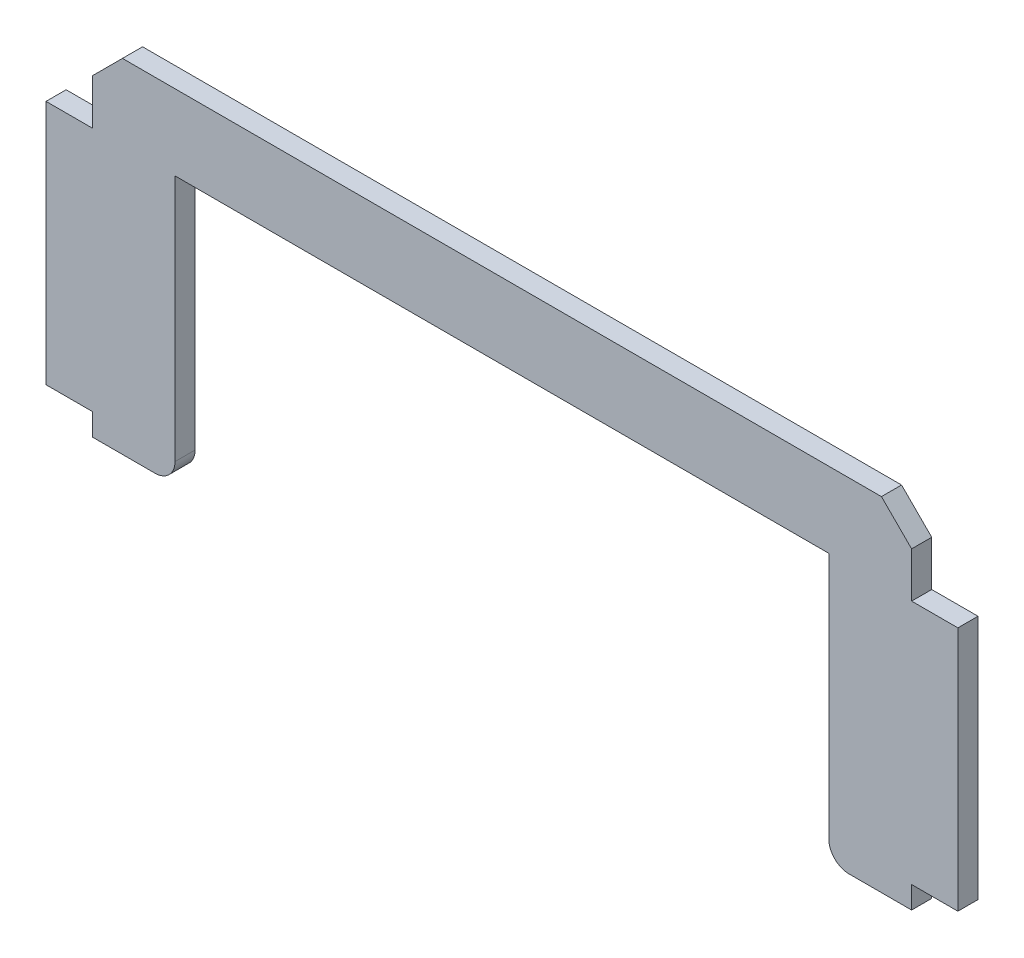
ISO-10303-21;
HEADER;
FILE_DESCRIPTION(('STEP AP214'),'2;1');
FILE_NAME('part.step','',(''),(''),'','','');
FILE_SCHEMA(('AUTOMOTIVE_DESIGN { 1 0 10303 214 1 1 1 1 }'));
ENDSEC;
DATA;
#1=APPLICATION_CONTEXT('core data for automotive mechanical design processes');
#2=APPLICATION_PROTOCOL_DEFINITION('international standard','automotive_design',2000,#1);
#3=PRODUCT_CONTEXT('',#1,'mechanical');
#4=PRODUCT('Part','Part','',(#3));
#5=PRODUCT_RELATED_PRODUCT_CATEGORY('part','',(#4));
#6=PRODUCT_DEFINITION_FORMATION('','',#4);
#7=PRODUCT_DEFINITION_CONTEXT('part definition',#1,'design');
#8=PRODUCT_DEFINITION('design','',#6,#7);
#9=PRODUCT_DEFINITION_SHAPE('','',#8);
#10=(LENGTH_UNIT() NAMED_UNIT(*) SI_UNIT(.MILLI.,.METRE.));
#11=(NAMED_UNIT(*) PLANE_ANGLE_UNIT() SI_UNIT($,.RADIAN.));
#12=(NAMED_UNIT(*) SI_UNIT($,.STERADIAN.) SOLID_ANGLE_UNIT());
#13=UNCERTAINTY_MEASURE_WITH_UNIT(LENGTH_MEASURE(1.E-05),#10,'distance_accuracy_value','');
#14=(GEOMETRIC_REPRESENTATION_CONTEXT(3) GLOBAL_UNCERTAINTY_ASSIGNED_CONTEXT((#13)) GLOBAL_UNIT_ASSIGNED_CONTEXT((#10,
#11,#12)) REPRESENTATION_CONTEXT('',''));
#15=CARTESIAN_POINT('',(0.,0.,0.));
#16=DIRECTION('',(0.,0.,1.));
#17=DIRECTION('',(1.,0.,0.));
#18=AXIS2_PLACEMENT_3D('',#15,#16,#17);
#19=CARTESIAN_POINT('',(16.2941,0.,2.54));
#20=DIRECTION('',(-1.,0.,0.));
#21=DIRECTION('',(0.,-1.,0.));
#22=AXIS2_PLACEMENT_3D('',#19,#20,#21);
#23=PLANE('',#22);
#24=DIRECTION('',(0.,1.,0.));
#25=VECTOR('',#24,1.);
#26=CARTESIAN_POINT('',(16.2941,0.,2.54));
#27=LINE('',#26,#25);
#28=CARTESIAN_POINT('',(16.2941,2.54,2.54));
#29=VERTEX_POINT('',#28);
#30=CARTESIAN_POINT('',(16.2941,33.782,2.54));
#31=VERTEX_POINT('',#30);
#32=EDGE_CURVE('E168',#29,#31,#27,.T.);
#33=ORIENTED_EDGE('',*,*,#32,.F.);
#34=DIRECTION('',(0.,0.,-1.));
#35=VECTOR('',#34,1.);
#36=CARTESIAN_POINT('',(16.2941,2.54,2.54));
#37=LINE('',#36,#35);
#38=CARTESIAN_POINT('',(16.2941,2.54,0.));
#39=VERTEX_POINT('',#38);
#40=EDGE_CURVE('E216',#29,#39,#37,.T.);
#41=ORIENTED_EDGE('',*,*,#40,.T.);
#42=DIRECTION('',(0.,1.,0.));
#43=VECTOR('',#42,1.);
#44=CARTESIAN_POINT('',(16.2941,0.,0.));
#45=LINE('',#44,#43);
#46=CARTESIAN_POINT('',(16.2941,33.782,0.));
#47=VERTEX_POINT('',#46);
#48=EDGE_CURVE('E191',#39,#47,#45,.T.);
#49=ORIENTED_EDGE('',*,*,#48,.T.);
#50=DIRECTION('',(0.,0.,-1.));
#51=VECTOR('',#50,1.);
#52=CARTESIAN_POINT('',(16.2941,33.782,2.54));
#53=LINE('',#52,#51);
#54=EDGE_CURVE('E185',#31,#47,#53,.T.);
#55=ORIENTED_EDGE('',*,*,#54,.F.);
#56=EDGE_LOOP('',(#33,#41,#49,#55));
#57=FACE_BOUND('',#56,.T.);
#58=ADVANCED_FACE('F33',(#57),#23,.F.);
#59=CARTESIAN_POINT('',(16.2941,33.782,2.54));
#60=DIRECTION('',(0.,1.,0.));
#61=DIRECTION('',(0.,0.,1.));
#62=AXIS2_PLACEMENT_3D('',#59,#60,#61);
#63=PLANE('',#62);
#64=DIRECTION('',(1.,0.,0.));
#65=VECTOR('',#64,1.);
#66=CARTESIAN_POINT('',(16.2941,33.782,0.));
#67=LINE('',#66,#65);
#68=CARTESIAN_POINT('',(98.8441,33.782,0.));
#69=VERTEX_POINT('',#68);
#70=EDGE_CURVE('E245',#47,#69,#67,.T.);
#71=ORIENTED_EDGE('',*,*,#70,.T.);
#72=DIRECTION('',(0.,0.,-1.));
#73=VECTOR('',#72,1.);
#74=CARTESIAN_POINT('',(98.8441,33.782,2.54));
#75=LINE('',#74,#73);
#76=CARTESIAN_POINT('',(98.8441,33.782,2.54));
#77=VERTEX_POINT('',#76);
#78=EDGE_CURVE('E187',#77,#69,#75,.T.);
#79=ORIENTED_EDGE('',*,*,#78,.F.);
#80=DIRECTION('',(1.,0.,0.));
#81=VECTOR('',#80,1.);
#82=CARTESIAN_POINT('',(16.2941,33.782,2.54));
#83=LINE('',#82,#81);
#84=EDGE_CURVE('E172',#31,#77,#83,.T.);
#85=ORIENTED_EDGE('',*,*,#84,.F.);
#86=ORIENTED_EDGE('',*,*,#54,.T.);
#87=EDGE_LOOP('',(#71,#79,#85,#86));
#88=FACE_BOUND('',#87,.T.);
#89=ADVANCED_FACE('F184',(#88),#63,.F.);
#90=CARTESIAN_POINT('',(98.8441,33.782,2.54));
#91=DIRECTION('',(1.,0.,0.));
#92=DIRECTION('',(0.,0.,-1.));
#93=AXIS2_PLACEMENT_3D('',#90,#91,#92);
#94=PLANE('',#93);
#95=DIRECTION('',(0.,-1.,0.));
#96=VECTOR('',#95,1.);
#97=CARTESIAN_POINT('',(98.8441,33.782,0.));
#98=LINE('',#97,#96);
#99=CARTESIAN_POINT('',(98.8441,2.54,0.));
#100=VERTEX_POINT('',#99);
#101=EDGE_CURVE('E241',#69,#100,#98,.T.);
#102=ORIENTED_EDGE('',*,*,#101,.T.);
#103=DIRECTION('',(0.,0.,-1.));
#104=VECTOR('',#103,1.);
#105=CARTESIAN_POINT('',(98.8441,2.54,2.54));
#106=LINE('',#105,#104);
#107=CARTESIAN_POINT('',(98.8441,2.54,2.54));
#108=VERTEX_POINT('',#107);
#109=EDGE_CURVE('E11',#100,#108,#106,.F.);
#110=ORIENTED_EDGE('',*,*,#109,.T.);
#111=DIRECTION('',(0.,-1.,0.));
#112=VECTOR('',#111,1.);
#113=CARTESIAN_POINT('',(98.8441,33.782,2.54));
#114=LINE('',#113,#112);
#115=EDGE_CURVE('E188',#77,#108,#114,.T.);
#116=ORIENTED_EDGE('',*,*,#115,.F.);
#117=ORIENTED_EDGE('',*,*,#78,.T.);
#118=EDGE_LOOP('',(#102,#110,#116,#117));
#119=FACE_BOUND('',#118,.T.);
#120=ADVANCED_FACE('F332',(#119),#94,.F.);
#121=CARTESIAN_POINT('',(98.8441,0.,2.54));
#122=DIRECTION('',(0.,1.,0.));
#123=DIRECTION('',(0.,0.,1.));
#124=AXIS2_PLACEMENT_3D('',#121,#122,#123);
#125=PLANE('',#124);
#126=DIRECTION('',(1.,0.,0.));
#127=VECTOR('',#126,1.);
#128=CARTESIAN_POINT('',(98.8441,0.,2.54));
#129=LINE('',#128,#127);
#130=CARTESIAN_POINT('',(101.3841,0.,2.54));
#131=VERTEX_POINT('',#130);
#132=CARTESIAN_POINT('',(109.2962,0.,2.54));
#133=VERTEX_POINT('',#132);
#134=EDGE_CURVE('E233',#131,#133,#129,.T.);
#135=ORIENTED_EDGE('',*,*,#134,.F.);
#136=DIRECTION('',(0.,0.,-1.));
#137=VECTOR('',#136,1.);
#138=CARTESIAN_POINT('',(101.3841,0.,2.54));
#139=LINE('',#138,#137);
#140=CARTESIAN_POINT('',(101.3841,0.,0.));
#141=VERTEX_POINT('',#140);
#142=EDGE_CURVE('E41',#131,#141,#139,.T.);
#143=ORIENTED_EDGE('',*,*,#142,.T.);
#144=DIRECTION('',(1.,0.,0.));
#145=VECTOR('',#144,1.);
#146=CARTESIAN_POINT('',(98.8441,0.,0.));
#147=LINE('',#146,#145);
#148=CARTESIAN_POINT('',(109.2962,0.,0.));
#149=VERTEX_POINT('',#148);
#150=EDGE_CURVE('E231',#141,#149,#147,.T.);
#151=ORIENTED_EDGE('',*,*,#150,.T.);
#152=DIRECTION('',(0.,0.,-1.));
#153=VECTOR('',#152,1.);
#154=CARTESIAN_POINT('',(109.2962,0.,2.54));
#155=LINE('',#154,#153);
#156=EDGE_CURVE('E197',#133,#149,#155,.T.);
#157=ORIENTED_EDGE('',*,*,#156,.F.);
#158=EDGE_LOOP('',(#135,#143,#151,#157));
#159=FACE_BOUND('',#158,.T.);
#160=ADVANCED_FACE('F229',(#159),#125,.F.);
#161=CARTESIAN_POINT('',(109.2962,0.,2.54));
#162=DIRECTION('',(-1.,0.,0.));
#163=DIRECTION('',(0.,0.,1.));
#164=AXIS2_PLACEMENT_3D('',#161,#162,#163);
#165=PLANE('',#164);
#166=DIRECTION('',(0.,1.,0.));
#167=VECTOR('',#166,1.);
#168=CARTESIAN_POINT('',(109.2962,0.,0.));
#169=LINE('',#168,#167);
#170=CARTESIAN_POINT('',(109.2962,2.79400000000002,0.));
#171=VERTEX_POINT('',#170);
#172=EDGE_CURVE('E240',#149,#171,#169,.T.);
#173=ORIENTED_EDGE('',*,*,#172,.T.);
#174=DIRECTION('',(0.,0.,-1.));
#175=VECTOR('',#174,1.);
#176=CARTESIAN_POINT('',(109.2962,2.79400000000002,2.54));
#177=LINE('',#176,#175);
#178=CARTESIAN_POINT('',(109.2962,2.79400000000002,2.54));
#179=VERTEX_POINT('',#178);
#180=EDGE_CURVE('E297',#179,#171,#177,.T.);
#181=ORIENTED_EDGE('',*,*,#180,.F.);
#182=DIRECTION('',(0.,1.,0.));
#183=VECTOR('',#182,1.);
#184=CARTESIAN_POINT('',(109.2962,0.,2.54));
#185=LINE('',#184,#183);
#186=EDGE_CURVE('E303',#133,#179,#185,.T.);
#187=ORIENTED_EDGE('',*,*,#186,.F.);
#188=ORIENTED_EDGE('',*,*,#156,.T.);
#189=EDGE_LOOP('',(#173,#181,#187,#188));
#190=FACE_BOUND('',#189,.T.);
#191=ADVANCED_FACE('F301',(#190),#165,.F.);
#192=CARTESIAN_POINT('',(109.2962,2.79400000000002,2.54));
#193=DIRECTION('',(0.,1.,0.));
#194=DIRECTION('',(-1.,0.,0.));
#195=AXIS2_PLACEMENT_3D('',#192,#193,#194);
#196=PLANE('',#195);
#197=DIRECTION('',(1.,0.,0.));
#198=VECTOR('',#197,1.);
#199=CARTESIAN_POINT('',(109.2962,2.79400000000002,0.));
#200=LINE('',#199,#198);
#201=CARTESIAN_POINT('',(115.1382,2.794,0.));
#202=VERTEX_POINT('',#201);
#203=EDGE_CURVE('E243',#171,#202,#200,.T.);
#204=ORIENTED_EDGE('',*,*,#203,.T.);
#205=DIRECTION('',(0.,0.,-1.));
#206=VECTOR('',#205,1.);
#207=CARTESIAN_POINT('',(115.1382,2.794,2.54));
#208=LINE('',#207,#206);
#209=CARTESIAN_POINT('',(115.1382,2.794,2.54));
#210=VERTEX_POINT('',#209);
#211=EDGE_CURVE('E294',#210,#202,#208,.T.);
#212=ORIENTED_EDGE('',*,*,#211,.F.);
#213=DIRECTION('',(1.,0.,0.));
#214=VECTOR('',#213,1.);
#215=CARTESIAN_POINT('',(109.2962,2.79400000000002,2.54));
#216=LINE('',#215,#214);
#217=EDGE_CURVE('E305',#179,#210,#216,.T.);
#218=ORIENTED_EDGE('',*,*,#217,.F.);
#219=ORIENTED_EDGE('',*,*,#180,.T.);
#220=EDGE_LOOP('',(#204,#212,#218,#219));
#221=FACE_BOUND('',#220,.T.);
#222=ADVANCED_FACE('F425',(#221),#196,.F.);
#223=CARTESIAN_POINT('',(115.1382,2.794,2.54));
#224=DIRECTION('',(-1.,0.,0.));
#225=DIRECTION('',(0.,0.,1.));
#226=AXIS2_PLACEMENT_3D('',#223,#224,#225);
#227=PLANE('',#226);
#228=DIRECTION('',(0.,1.,0.));
#229=VECTOR('',#228,1.);
#230=CARTESIAN_POINT('',(115.1382,2.794,0.));
#231=LINE('',#230,#229);
#232=CARTESIAN_POINT('',(115.1382,33.782,0.));
#233=VERTEX_POINT('',#232);
#234=EDGE_CURVE('E250',#202,#233,#231,.T.);
#235=ORIENTED_EDGE('',*,*,#234,.T.);
#236=DIRECTION('',(0.,0.,-1.));
#237=VECTOR('',#236,1.);
#238=CARTESIAN_POINT('',(115.1382,33.782,2.54));
#239=LINE('',#238,#237);
#240=CARTESIAN_POINT('',(115.1382,33.782,2.54));
#241=VERTEX_POINT('',#240);
#242=EDGE_CURVE('E291',#241,#233,#239,.T.);
#243=ORIENTED_EDGE('',*,*,#242,.F.);
#244=DIRECTION('',(0.,1.,0.));
#245=VECTOR('',#244,1.);
#246=CARTESIAN_POINT('',(115.1382,2.794,2.54));
#247=LINE('',#246,#245);
#248=EDGE_CURVE('E307',#210,#241,#247,.T.);
#249=ORIENTED_EDGE('',*,*,#248,.F.);
#250=ORIENTED_EDGE('',*,*,#211,.T.);
#251=EDGE_LOOP('',(#235,#243,#249,#250));
#252=FACE_BOUND('',#251,.T.);
#253=ADVANCED_FACE('F421',(#252),#227,.F.);
#254=CARTESIAN_POINT('',(115.1382,33.782,2.54));
#255=DIRECTION('',(0.,-1.,0.));
#256=DIRECTION('',(1.,0.,0.));
#257=AXIS2_PLACEMENT_3D('',#254,#255,#256);
#258=PLANE('',#257);
#259=DIRECTION('',(-1.,0.,0.));
#260=VECTOR('',#259,1.);
#261=CARTESIAN_POINT('',(115.1382,33.782,0.));
#262=LINE('',#261,#260);
#263=CARTESIAN_POINT('',(109.2962,33.782,0.));
#264=VERTEX_POINT('',#263);
#265=EDGE_CURVE('E252',#233,#264,#262,.T.);
#266=ORIENTED_EDGE('',*,*,#265,.T.);
#267=DIRECTION('',(0.,0.,-1.));
#268=VECTOR('',#267,1.);
#269=CARTESIAN_POINT('',(109.2962,33.782,2.54));
#270=LINE('',#269,#268);
#271=CARTESIAN_POINT('',(109.2962,33.782,2.54));
#272=VERTEX_POINT('',#271);
#273=EDGE_CURVE('E288',#272,#264,#270,.T.);
#274=ORIENTED_EDGE('',*,*,#273,.F.);
#275=DIRECTION('',(-1.,0.,0.));
#276=VECTOR('',#275,1.);
#277=CARTESIAN_POINT('',(115.1382,33.782,2.54));
#278=LINE('',#277,#276);
#279=EDGE_CURVE('E313',#241,#272,#278,.T.);
#280=ORIENTED_EDGE('',*,*,#279,.F.);
#281=ORIENTED_EDGE('',*,*,#242,.T.);
#282=EDGE_LOOP('',(#266,#274,#280,#281));
#283=FACE_BOUND('',#282,.T.);
#284=ADVANCED_FACE('F417',(#283),#258,.F.);
#285=CARTESIAN_POINT('',(109.2962,33.782,2.54));
#286=DIRECTION('',(-1.,0.,0.));
#287=DIRECTION('',(0.,0.,1.));
#288=AXIS2_PLACEMENT_3D('',#285,#286,#287);
#289=PLANE('',#288);
#290=DIRECTION('',(0.,1.,0.));
#291=VECTOR('',#290,1.);
#292=CARTESIAN_POINT('',(109.2962,33.782,0.));
#293=LINE('',#292,#291);
#294=CARTESIAN_POINT('',(109.2962,39.497,0.));
#295=VERTEX_POINT('',#294);
#296=EDGE_CURVE('E254',#264,#295,#293,.T.);
#297=ORIENTED_EDGE('',*,*,#296,.T.);
#298=DIRECTION('',(0.,0.,1.));
#299=VECTOR('',#298,1.);
#300=CARTESIAN_POINT('',(109.2962,39.497,2.54));
#301=LINE('',#300,#299);
#302=CARTESIAN_POINT('',(109.2962,39.497,2.54));
#303=VERTEX_POINT('',#302);
#304=EDGE_CURVE('E207',#295,#303,#301,.T.);
#305=ORIENTED_EDGE('',*,*,#304,.T.);
#306=DIRECTION('',(0.,1.,0.));
#307=VECTOR('',#306,1.);
#308=CARTESIAN_POINT('',(109.2962,33.782,2.54));
#309=LINE('',#308,#307);
#310=EDGE_CURVE('E315',#272,#303,#309,.T.);
#311=ORIENTED_EDGE('',*,*,#310,.F.);
#312=ORIENTED_EDGE('',*,*,#273,.T.);
#313=EDGE_LOOP('',(#297,#305,#311,#312));
#314=FACE_BOUND('',#313,.T.);
#315=ADVANCED_FACE('F413',(#314),#289,.F.);
#316=CARTESIAN_POINT('',(109.2962,43.307,2.54));
#317=DIRECTION('',(0.,-1.,0.));
#318=DIRECTION('',(1.,0.,0.));
#319=AXIS2_PLACEMENT_3D('',#316,#317,#318);
#320=PLANE('',#319);
#321=DIRECTION('',(-1.,0.,0.));
#322=VECTOR('',#321,1.);
#323=CARTESIAN_POINT('',(109.2962,43.307,2.54));
#324=LINE('',#323,#322);
#325=CARTESIAN_POINT('',(105.4862,43.307,2.54));
#326=VERTEX_POINT('',#325);
#327=CARTESIAN_POINT('',(9.65200000000002,43.307,2.54));
#328=VERTEX_POINT('',#327);
#329=EDGE_CURVE('E318',#326,#328,#324,.T.);
#330=ORIENTED_EDGE('',*,*,#329,.F.);
#331=DIRECTION('',(0.,0.,-1.));
#332=VECTOR('',#331,1.);
#333=CARTESIAN_POINT('',(105.4862,43.307,2.54));
#334=LINE('',#333,#332);
#335=CARTESIAN_POINT('',(105.4862,43.307,0.));
#336=VERTEX_POINT('',#335);
#337=EDGE_CURVE('E195',#326,#336,#334,.T.);
#338=ORIENTED_EDGE('',*,*,#337,.T.);
#339=DIRECTION('',(-1.,0.,0.));
#340=VECTOR('',#339,1.);
#341=CARTESIAN_POINT('',(109.2962,43.307,0.));
#342=LINE('',#341,#340);
#343=CARTESIAN_POINT('',(9.65200000000001,43.307,0.));
#344=VERTEX_POINT('',#343);
#345=EDGE_CURVE('E257',#336,#344,#342,.T.);
#346=ORIENTED_EDGE('',*,*,#345,.T.);
#347=DIRECTION('',(0.,0.,1.));
#348=VECTOR('',#347,1.);
#349=CARTESIAN_POINT('',(9.65200000000001,43.307,2.54));
#350=LINE('',#349,#348);
#351=EDGE_CURVE('E193',#344,#328,#350,.T.);
#352=ORIENTED_EDGE('',*,*,#351,.T.);
#353=EDGE_LOOP('',(#330,#338,#346,#352));
#354=FACE_BOUND('',#353,.T.);
#355=ADVANCED_FACE('F410',(#354),#320,.F.);
#356=CARTESIAN_POINT('',(5.842,43.307,2.54));
#357=DIRECTION('',(1.,0.,0.));
#358=DIRECTION('',(0.,1.,0.));
#359=AXIS2_PLACEMENT_3D('',#356,#357,#358);
#360=PLANE('',#359);
#361=DIRECTION('',(0.,-1.,0.));
#362=VECTOR('',#361,1.);
#363=CARTESIAN_POINT('',(5.842,43.307,2.54));
#364=LINE('',#363,#362);
#365=CARTESIAN_POINT('',(5.842,39.497,2.54));
#366=VERTEX_POINT('',#365);
#367=CARTESIAN_POINT('',(5.842,33.782,2.54));
#368=VERTEX_POINT('',#367);
#369=EDGE_CURVE('E321',#366,#368,#364,.T.);
#370=ORIENTED_EDGE('',*,*,#369,.F.);
#371=DIRECTION('',(0.,0.,-1.));
#372=VECTOR('',#371,1.);
#373=CARTESIAN_POINT('',(5.842,39.497,2.54));
#374=LINE('',#373,#372);
#375=CARTESIAN_POINT('',(5.842,39.497,0.));
#376=VERTEX_POINT('',#375);
#377=EDGE_CURVE('E213',#366,#376,#374,.T.);
#378=ORIENTED_EDGE('',*,*,#377,.T.);
#379=DIRECTION('',(0.,-1.,0.));
#380=VECTOR('',#379,1.);
#381=CARTESIAN_POINT('',(5.842,43.307,0.));
#382=LINE('',#381,#380);
#383=CARTESIAN_POINT('',(5.842,33.782,0.));
#384=VERTEX_POINT('',#383);
#385=EDGE_CURVE('E260',#376,#384,#382,.T.);
#386=ORIENTED_EDGE('',*,*,#385,.T.);
#387=DIRECTION('',(0.,0.,-1.));
#388=VECTOR('',#387,1.);
#389=CARTESIAN_POINT('',(5.842,33.782,2.54));
#390=LINE('',#389,#388);
#391=EDGE_CURVE('E285',#368,#384,#390,.T.);
#392=ORIENTED_EDGE('',*,*,#391,.F.);
#393=EDGE_LOOP('',(#370,#378,#386,#392));
#394=FACE_BOUND('',#393,.T.);
#395=ADVANCED_FACE('F364',(#394),#360,.F.);
#396=CARTESIAN_POINT('',(5.842,33.782,2.54));
#397=DIRECTION('',(0.,-1.,0.));
#398=DIRECTION('',(0.,0.,-1.));
#399=AXIS2_PLACEMENT_3D('',#396,#397,#398);
#400=PLANE('',#399);
#401=DIRECTION('',(-1.,0.,0.));
#402=VECTOR('',#401,1.);
#403=CARTESIAN_POINT('',(5.842,33.782,0.));
#404=LINE('',#403,#402);
#405=CARTESIAN_POINT('',(0.,33.782,0.));
#406=VERTEX_POINT('',#405);
#407=EDGE_CURVE('E262',#384,#406,#404,.T.);
#408=ORIENTED_EDGE('',*,*,#407,.T.);
#409=DIRECTION('',(0.,0.,-1.));
#410=VECTOR('',#409,1.);
#411=CARTESIAN_POINT('',(0.,33.782,2.54));
#412=LINE('',#411,#410);
#413=CARTESIAN_POINT('',(0.,33.782,2.54));
#414=VERTEX_POINT('',#413);
#415=EDGE_CURVE('E282',#414,#406,#412,.T.);
#416=ORIENTED_EDGE('',*,*,#415,.F.);
#417=DIRECTION('',(-1.,0.,0.));
#418=VECTOR('',#417,1.);
#419=CARTESIAN_POINT('',(5.842,33.782,2.54));
#420=LINE('',#419,#418);
#421=EDGE_CURVE('E323',#368,#414,#420,.T.);
#422=ORIENTED_EDGE('',*,*,#421,.F.);
#423=ORIENTED_EDGE('',*,*,#391,.T.);
#424=EDGE_LOOP('',(#408,#416,#422,#423));
#425=FACE_BOUND('',#424,.T.);
#426=ADVANCED_FACE('F370',(#425),#400,.F.);
#427=CARTESIAN_POINT('',(0.,33.782,2.54));
#428=DIRECTION('',(1.,0.,0.));
#429=DIRECTION('',(0.,1.,0.));
#430=AXIS2_PLACEMENT_3D('',#427,#428,#429);
#431=PLANE('',#430);
#432=DIRECTION('',(0.,-1.,0.));
#433=VECTOR('',#432,1.);
#434=CARTESIAN_POINT('',(0.,33.782,0.));
#435=LINE('',#434,#433);
#436=CARTESIAN_POINT('',(0.,2.794,0.));
#437=VERTEX_POINT('',#436);
#438=EDGE_CURVE('E264',#406,#437,#435,.T.);
#439=ORIENTED_EDGE('',*,*,#438,.T.);
#440=DIRECTION('',(0.,0.,-1.));
#441=VECTOR('',#440,1.);
#442=CARTESIAN_POINT('',(0.,2.794,2.54));
#443=LINE('',#442,#441);
#444=CARTESIAN_POINT('',(0.,2.794,2.54));
#445=VERTEX_POINT('',#444);
#446=EDGE_CURVE('E279',#445,#437,#443,.T.);
#447=ORIENTED_EDGE('',*,*,#446,.F.);
#448=DIRECTION('',(0.,-1.,0.));
#449=VECTOR('',#448,1.);
#450=CARTESIAN_POINT('',(0.,33.782,2.54));
#451=LINE('',#450,#449);
#452=EDGE_CURVE('E325',#414,#445,#451,.T.);
#453=ORIENTED_EDGE('',*,*,#452,.F.);
#454=ORIENTED_EDGE('',*,*,#415,.T.);
#455=EDGE_LOOP('',(#439,#447,#453,#454));
#456=FACE_BOUND('',#455,.T.);
#457=ADVANCED_FACE('F376',(#456),#431,.F.);
#458=CARTESIAN_POINT('',(0.,2.794,2.54));
#459=DIRECTION('',(0.,1.,0.));
#460=DIRECTION('',(0.,0.,1.));
#461=AXIS2_PLACEMENT_3D('',#458,#459,#460);
#462=PLANE('',#461);
#463=DIRECTION('',(1.,0.,0.));
#464=VECTOR('',#463,1.);
#465=CARTESIAN_POINT('',(0.,2.794,0.));
#466=LINE('',#465,#464);
#467=CARTESIAN_POINT('',(5.84200000000001,2.794,0.));
#468=VERTEX_POINT('',#467);
#469=EDGE_CURVE('E266',#437,#468,#466,.T.);
#470=ORIENTED_EDGE('',*,*,#469,.T.);
#471=DIRECTION('',(0.,0.,-1.));
#472=VECTOR('',#471,1.);
#473=CARTESIAN_POINT('',(5.84200000000001,2.794,2.54));
#474=LINE('',#473,#472);
#475=CARTESIAN_POINT('',(5.84200000000001,2.794,2.54));
#476=VERTEX_POINT('',#475);
#477=EDGE_CURVE('E275',#476,#468,#474,.T.);
#478=ORIENTED_EDGE('',*,*,#477,.F.);
#479=DIRECTION('',(1.,0.,0.));
#480=VECTOR('',#479,1.);
#481=CARTESIAN_POINT('',(0.,2.794,2.54));
#482=LINE('',#481,#480);
#483=EDGE_CURVE('E327',#445,#476,#482,.T.);
#484=ORIENTED_EDGE('',*,*,#483,.F.);
#485=ORIENTED_EDGE('',*,*,#446,.T.);
#486=EDGE_LOOP('',(#470,#478,#484,#485));
#487=FACE_BOUND('',#486,.T.);
#488=ADVANCED_FACE('F380',(#487),#462,.F.);
#489=CARTESIAN_POINT('',(5.84200000000001,2.794,2.54));
#490=DIRECTION('',(1.,0.,0.));
#491=DIRECTION('',(0.,0.,-1.));
#492=AXIS2_PLACEMENT_3D('',#489,#490,#491);
#493=PLANE('',#492);
#494=DIRECTION('',(0.,-1.,0.));
#495=VECTOR('',#494,1.);
#496=CARTESIAN_POINT('',(5.84200000000001,2.794,0.));
#497=LINE('',#496,#495);
#498=CARTESIAN_POINT('',(5.84200000000001,0.,0.));
#499=VERTEX_POINT('',#498);
#500=EDGE_CURVE('E268',#468,#499,#497,.T.);
#501=ORIENTED_EDGE('',*,*,#500,.T.);
#502=DIRECTION('',(0.,0.,-1.));
#503=VECTOR('',#502,1.);
#504=CARTESIAN_POINT('',(5.84200000000001,0.,2.54));
#505=LINE('',#504,#503);
#506=CARTESIAN_POINT('',(5.84200000000001,0.,2.54));
#507=VERTEX_POINT('',#506);
#508=EDGE_CURVE('E272',#507,#499,#505,.T.);
#509=ORIENTED_EDGE('',*,*,#508,.F.);
#510=DIRECTION('',(0.,-1.,0.));
#511=VECTOR('',#510,1.);
#512=CARTESIAN_POINT('',(5.84200000000001,2.794,2.54));
#513=LINE('',#512,#511);
#514=EDGE_CURVE('E329',#476,#507,#513,.T.);
#515=ORIENTED_EDGE('',*,*,#514,.F.);
#516=ORIENTED_EDGE('',*,*,#477,.T.);
#517=EDGE_LOOP('',(#501,#509,#515,#516));
#518=FACE_BOUND('',#517,.T.);
#519=ADVANCED_FACE('F385',(#518),#493,.F.);
#520=CARTESIAN_POINT('',(5.84200000000001,0.,2.54));
#521=DIRECTION('',(0.,1.,0.));
#522=DIRECTION('',(0.,0.,1.));
#523=AXIS2_PLACEMENT_3D('',#520,#521,#522);
#524=PLANE('',#523);
#525=DIRECTION('',(1.,0.,0.));
#526=VECTOR('',#525,1.);
#527=CARTESIAN_POINT('',(5.84200000000001,0.,0.));
#528=LINE('',#527,#526);
#529=CARTESIAN_POINT('',(13.7541,0.,0.));
#530=VERTEX_POINT('',#529);
#531=EDGE_CURVE('E180',#499,#530,#528,.T.);
#532=ORIENTED_EDGE('',*,*,#531,.T.);
#533=DIRECTION('',(0.,0.,-1.));
#534=VECTOR('',#533,1.);
#535=CARTESIAN_POINT('',(13.7541,0.,2.54));
#536=LINE('',#535,#534);
#537=CARTESIAN_POINT('',(13.7541,0.,2.54));
#538=VERTEX_POINT('',#537);
#539=EDGE_CURVE('E222',#530,#538,#536,.F.);
#540=ORIENTED_EDGE('',*,*,#539,.T.);
#541=DIRECTION('',(1.,0.,0.));
#542=VECTOR('',#541,1.);
#543=CARTESIAN_POINT('',(5.84200000000001,0.,2.54));
#544=LINE('',#543,#542);
#545=EDGE_CURVE('E276',#507,#538,#544,.T.);
#546=ORIENTED_EDGE('',*,*,#545,.F.);
#547=ORIENTED_EDGE('',*,*,#508,.T.);
#548=EDGE_LOOP('',(#532,#540,#546,#547));
#549=FACE_BOUND('',#548,.T.);
#550=ADVANCED_FACE('F390',(#549),#524,.F.);
#551=CARTESIAN_POINT('',(0.,0.,2.54));
#552=DIRECTION('',(0.,0.,-1.));
#553=DIRECTION('',(-1.,0.,0.));
#554=AXIS2_PLACEMENT_3D('',#551,#552,#553);
#555=PLANE('',#554);
#556=ORIENTED_EDGE('',*,*,#545,.T.);
#557=CARTESIAN_POINT('',(13.7541,2.54,2.54));
#558=DIRECTION('',(0.,0.,-1.));
#559=DIRECTION('',(-1.,0.,0.));
#560=AXIS2_PLACEMENT_3D('',#557,#558,#559);
#561=CIRCLE('',#560,2.54);
#562=EDGE_CURVE('E175',#538,#29,#561,.F.);
#563=ORIENTED_EDGE('',*,*,#562,.T.);
#564=ORIENTED_EDGE('',*,*,#32,.T.);
#565=ORIENTED_EDGE('',*,*,#84,.T.);
#566=ORIENTED_EDGE('',*,*,#115,.T.);
#567=CARTESIAN_POINT('',(101.3841,2.54,2.54));
#568=DIRECTION('',(0.,0.,-1.));
#569=DIRECTION('',(-1.,0.,0.));
#570=AXIS2_PLACEMENT_3D('',#567,#568,#569);
#571=CIRCLE('',#570,2.54);
#572=EDGE_CURVE('E48',#108,#131,#571,.F.);
#573=ORIENTED_EDGE('',*,*,#572,.T.);
#574=ORIENTED_EDGE('',*,*,#134,.T.);
#575=ORIENTED_EDGE('',*,*,#186,.T.);
#576=ORIENTED_EDGE('',*,*,#217,.T.);
#577=ORIENTED_EDGE('',*,*,#248,.T.);
#578=ORIENTED_EDGE('',*,*,#279,.T.);
#579=ORIENTED_EDGE('',*,*,#310,.T.);
#580=DIRECTION('',(0.707106781186546,-0.707106781186549,0.));
#581=VECTOR('',#580,1.);
#582=CARTESIAN_POINT('',(105.4862,43.307,2.54));
#583=LINE('',#582,#581);
#584=EDGE_CURVE('E211',#303,#326,#583,.F.);
#585=ORIENTED_EDGE('',*,*,#584,.T.);
#586=ORIENTED_EDGE('',*,*,#329,.T.);
#587=DIRECTION('',(0.707106781186548,0.707106781186548,0.));
#588=VECTOR('',#587,1.);
#589=CARTESIAN_POINT('',(5.842,39.497,2.54));
#590=LINE('',#589,#588);
#591=EDGE_CURVE('E209',#328,#366,#590,.F.);
#592=ORIENTED_EDGE('',*,*,#591,.T.);
#593=ORIENTED_EDGE('',*,*,#369,.T.);
#594=ORIENTED_EDGE('',*,*,#421,.T.);
#595=ORIENTED_EDGE('',*,*,#452,.T.);
#596=ORIENTED_EDGE('',*,*,#483,.T.);
#597=ORIENTED_EDGE('',*,*,#514,.T.);
#598=EDGE_LOOP('',(#556,#563,#564,#565,#566,#573,#574,#575,#576,#577,#578,#579,#585,#586,#592,
#593,#594,#595,#596,#597));
#599=FACE_BOUND('',#598,.T.);
#600=ADVANCED_FACE('F171',(#599),#555,.F.);
#601=CARTESIAN_POINT('',(0.,0.,0.));
#602=DIRECTION('',(0.,0.,-1.));
#603=DIRECTION('',(-1.,0.,0.));
#604=AXIS2_PLACEMENT_3D('',#601,#602,#603);
#605=PLANE('',#604);
#606=ORIENTED_EDGE('',*,*,#48,.F.);
#607=CARTESIAN_POINT('',(13.7541,2.54,0.));
#608=DIRECTION('',(0.,0.,-1.));
#609=DIRECTION('',(-1.,0.,0.));
#610=AXIS2_PLACEMENT_3D('',#607,#608,#609);
#611=CIRCLE('',#610,2.54);
#612=EDGE_CURVE('E220',#39,#530,#611,.T.);
#613=ORIENTED_EDGE('',*,*,#612,.T.);
#614=ORIENTED_EDGE('',*,*,#531,.F.);
#615=ORIENTED_EDGE('',*,*,#500,.F.);
#616=ORIENTED_EDGE('',*,*,#469,.F.);
#617=ORIENTED_EDGE('',*,*,#438,.F.);
#618=ORIENTED_EDGE('',*,*,#407,.F.);
#619=ORIENTED_EDGE('',*,*,#385,.F.);
#620=DIRECTION('',(-0.707106781186548,-0.707106781186548,0.));
#621=VECTOR('',#620,1.);
#622=CARTESIAN_POINT('',(-16.8275,16.8275,0.));
#623=LINE('',#622,#621);
#624=EDGE_CURVE('E203',#376,#344,#623,.F.);
#625=ORIENTED_EDGE('',*,*,#624,.T.);
#626=ORIENTED_EDGE('',*,*,#345,.F.);
#627=DIRECTION('',(-0.707106781186546,0.707106781186549,0.));
#628=VECTOR('',#627,1.);
#629=CARTESIAN_POINT('',(74.3966000000002,74.3965999999999,0.));
#630=LINE('',#629,#628);
#631=EDGE_CURVE('E205',#336,#295,#630,.F.);
#632=ORIENTED_EDGE('',*,*,#631,.T.);
#633=ORIENTED_EDGE('',*,*,#296,.F.);
#634=ORIENTED_EDGE('',*,*,#265,.F.);
#635=ORIENTED_EDGE('',*,*,#234,.F.);
#636=ORIENTED_EDGE('',*,*,#203,.F.);
#637=ORIENTED_EDGE('',*,*,#172,.F.);
#638=ORIENTED_EDGE('',*,*,#150,.F.);
#639=CARTESIAN_POINT('',(101.3841,2.54,0.));
#640=DIRECTION('',(0.,0.,-1.));
#641=DIRECTION('',(-1.,0.,0.));
#642=AXIS2_PLACEMENT_3D('',#639,#640,#641);
#643=CIRCLE('',#642,2.54);
#644=EDGE_CURVE('E218',#141,#100,#643,.T.);
#645=ORIENTED_EDGE('',*,*,#644,.T.);
#646=ORIENTED_EDGE('',*,*,#101,.F.);
#647=ORIENTED_EDGE('',*,*,#70,.F.);
#648=EDGE_LOOP('',(#606,#613,#614,#615,#616,#617,#618,#619,#625,#626,#632,#633,#634,#635,#636,
#637,#638,#645,#646,#647));
#649=FACE_BOUND('',#648,.T.);
#650=ADVANCED_FACE('F237',(#649),#605,.T.);
#651=CARTESIAN_POINT('',(105.4862,43.307,2.54));
#652=DIRECTION('',(-0.707106781186549,-0.707106781186546,0.));
#653=DIRECTION('',(0.,0.,-1.));
#654=AXIS2_PLACEMENT_3D('',#651,#652,#653);
#655=PLANE('',#654);
#656=ORIENTED_EDGE('',*,*,#584,.F.);
#657=ORIENTED_EDGE('',*,*,#304,.F.);
#658=ORIENTED_EDGE('',*,*,#631,.F.);
#659=ORIENTED_EDGE('',*,*,#337,.F.);
#660=EDGE_LOOP('',(#656,#657,#658,#659));
#661=FACE_BOUND('',#660,.T.);
#662=ADVANCED_FACE('F350',(#661),#655,.F.);
#663=CARTESIAN_POINT('',(5.842,39.497,2.54));
#664=DIRECTION('',(0.707106781186548,-0.707106781186548,0.));
#665=DIRECTION('',(0.,0.,-1.));
#666=AXIS2_PLACEMENT_3D('',#663,#664,#665);
#667=PLANE('',#666);
#668=ORIENTED_EDGE('',*,*,#591,.F.);
#669=ORIENTED_EDGE('',*,*,#351,.F.);
#670=ORIENTED_EDGE('',*,*,#624,.F.);
#671=ORIENTED_EDGE('',*,*,#377,.F.);
#672=EDGE_LOOP('',(#668,#669,#670,#671));
#673=FACE_BOUND('',#672,.T.);
#674=ADVANCED_FACE('F338',(#673),#667,.F.);
#675=CARTESIAN_POINT('',(13.7541,2.54,2.54));
#676=DIRECTION('',(0.,0.,-1.));
#677=DIRECTION('',(-1.,0.,0.));
#678=AXIS2_PLACEMENT_3D('',#675,#676,#677);
#679=CYLINDRICAL_SURFACE('',#678,2.54);
#680=ORIENTED_EDGE('',*,*,#562,.F.);
#681=ORIENTED_EDGE('',*,*,#539,.F.);
#682=ORIENTED_EDGE('',*,*,#612,.F.);
#683=ORIENTED_EDGE('',*,*,#40,.F.);
#684=EDGE_LOOP('',(#680,#681,#682,#683));
#685=FACE_BOUND('',#684,.T.);
#686=ADVANCED_FACE('F334',(#685),#679,.T.);
#687=CARTESIAN_POINT('',(101.3841,2.54,2.54));
#688=DIRECTION('',(0.,0.,-1.));
#689=DIRECTION('',(-1.,0.,0.));
#690=AXIS2_PLACEMENT_3D('',#687,#688,#689);
#691=CYLINDRICAL_SURFACE('',#690,2.54);
#692=ORIENTED_EDGE('',*,*,#572,.F.);
#693=ORIENTED_EDGE('',*,*,#109,.F.);
#694=ORIENTED_EDGE('',*,*,#644,.F.);
#695=ORIENTED_EDGE('',*,*,#142,.F.);
#696=EDGE_LOOP('',(#692,#693,#694,#695));
#697=FACE_BOUND('',#696,.T.);
#698=ADVANCED_FACE('F35',(#697),#691,.T.);
#699=CLOSED_SHELL('',(#58,#89,#120,#160,#191,#222,#253,#284,#315,#355,#395,#426,#457,#488,#519,
#550,#600,#650,#662,#674,#686,#698));
#700=MANIFOLD_SOLID_BREP('B2',#699);
#701=ADVANCED_BREP_SHAPE_REPRESENTATION('',(#18,#700),#14);
#702=SHAPE_DEFINITION_REPRESENTATION(#9,#701);
ENDSEC;
END-ISO-10303-21;
